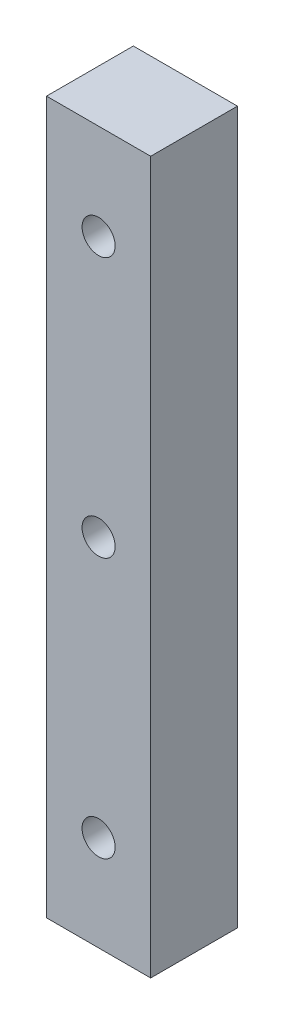
ISO-10303-21;
HEADER;
FILE_DESCRIPTION(('STEP AP214'),'2;1');
FILE_NAME('part.step','',(''),(''),'','','');
FILE_SCHEMA(('AUTOMOTIVE_DESIGN { 1 0 10303 214 1 1 1 1 }'));
ENDSEC;
DATA;
#1=APPLICATION_CONTEXT('core data for automotive mechanical design processes');
#2=APPLICATION_PROTOCOL_DEFINITION('international standard','automotive_design',2000,#1);
#3=PRODUCT_CONTEXT('',#1,'mechanical');
#4=PRODUCT('Part','Part','',(#3));
#5=PRODUCT_RELATED_PRODUCT_CATEGORY('part','',(#4));
#6=PRODUCT_DEFINITION_FORMATION('','',#4);
#7=PRODUCT_DEFINITION_CONTEXT('part definition',#1,'design');
#8=PRODUCT_DEFINITION('design','',#6,#7);
#9=PRODUCT_DEFINITION_SHAPE('','',#8);
#10=(LENGTH_UNIT() NAMED_UNIT(*) SI_UNIT(.MILLI.,.METRE.));
#11=(NAMED_UNIT(*) PLANE_ANGLE_UNIT() SI_UNIT($,.RADIAN.));
#12=(NAMED_UNIT(*) SI_UNIT($,.STERADIAN.) SOLID_ANGLE_UNIT());
#13=UNCERTAINTY_MEASURE_WITH_UNIT(LENGTH_MEASURE(1.E-05),#10,'distance_accuracy_value','');
#14=(GEOMETRIC_REPRESENTATION_CONTEXT(3) GLOBAL_UNCERTAINTY_ASSIGNED_CONTEXT((#13)) GLOBAL_UNIT_ASSIGNED_CONTEXT((#10,
#11,#12)) REPRESENTATION_CONTEXT('',''));
#15=CARTESIAN_POINT('',(0.,0.,0.));
#16=DIRECTION('',(0.,0.,1.));
#17=DIRECTION('',(1.,0.,0.));
#18=AXIS2_PLACEMENT_3D('',#15,#16,#17);
#19=CARTESIAN_POINT('',(0.,204.999999956,0.));
#20=DIRECTION('',(-1.,0.,0.));
#21=DIRECTION('',(0.,0.,1.));
#22=AXIS2_PLACEMENT_3D('',#19,#20,#21);
#23=PLANE('',#22);
#24=DIRECTION('',(0.,0.,-1.));
#25=VECTOR('',#24,1.);
#26=CARTESIAN_POINT('',(0.,0.,0.));
#27=LINE('',#26,#25);
#28=CARTESIAN_POINT('',(0.,0.,25.000000038));
#29=VERTEX_POINT('',#28);
#30=CARTESIAN_POINT('',(0.,0.,0.));
#31=VERTEX_POINT('',#30);
#32=EDGE_CURVE('E110',#29,#31,#27,.T.);
#33=ORIENTED_EDGE('',*,*,#32,.T.);
#34=DIRECTION('',(0.,-1.,0.));
#35=VECTOR('',#34,1.);
#36=CARTESIAN_POINT('',(0.,204.999999956,0.));
#37=LINE('',#36,#35);
#38=CARTESIAN_POINT('',(0.,204.999999956,0.));
#39=VERTEX_POINT('',#38);
#40=EDGE_CURVE('E11',#39,#31,#37,.T.);
#41=ORIENTED_EDGE('',*,*,#40,.F.);
#42=DIRECTION('',(0.,0.,-1.));
#43=VECTOR('',#42,1.);
#44=CARTESIAN_POINT('',(0.,204.999999956,0.));
#45=LINE('',#44,#43);
#46=CARTESIAN_POINT('',(0.,204.999999956,25.000000038));
#47=VERTEX_POINT('',#46);
#48=EDGE_CURVE('E92',#47,#39,#45,.T.);
#49=ORIENTED_EDGE('',*,*,#48,.F.);
#50=DIRECTION('',(0.,-1.,0.));
#51=VECTOR('',#50,1.);
#52=CARTESIAN_POINT('',(0.,204.999999956,25.000000038));
#53=LINE('',#52,#51);
#54=EDGE_CURVE('E103',#47,#29,#53,.T.);
#55=ORIENTED_EDGE('',*,*,#54,.T.);
#56=EDGE_LOOP('',(#33,#41,#49,#55));
#57=FACE_BOUND('',#56,.T.);
#58=ADVANCED_FACE('F42',(#57),#23,.F.);
#59=CARTESIAN_POINT('',(0.,204.999999956,0.));
#60=DIRECTION('',(0.,0.,1.));
#61=DIRECTION('',(1.,0.,0.));
#62=AXIS2_PLACEMENT_3D('',#59,#60,#61);
#63=PLANE('',#62);
#64=CARTESIAN_POINT('',(-14.999999972,177.499999965,0.));
#65=DIRECTION('',(0.,0.,-1.));
#66=DIRECTION('',(-1.,0.,0.));
#67=AXIS2_PLACEMENT_3D('',#64,#65,#66);
#68=CIRCLE('',#67,4.76249999999999);
#69=CARTESIAN_POINT('',(-19.762499972,177.499999965,0.));
#70=VERTEX_POINT('',#69);
#71=EDGE_CURVE('E130',#70,#70,#68,.T.);
#72=ORIENTED_EDGE('',*,*,#71,.F.);
#73=EDGE_LOOP('',(#72));
#74=FACE_BOUND('',#73,.T.);
#75=CARTESIAN_POINT('',(-14.999999972,27.499999991,0.));
#76=DIRECTION('',(0.,0.,-1.));
#77=DIRECTION('',(-1.,0.,0.));
#78=AXIS2_PLACEMENT_3D('',#75,#76,#77);
#79=CIRCLE('',#78,4.7625);
#80=CARTESIAN_POINT('',(-19.762499972,27.499999991,0.));
#81=VERTEX_POINT('',#80);
#82=EDGE_CURVE('E127',#81,#81,#79,.T.);
#83=ORIENTED_EDGE('',*,*,#82,.F.);
#84=EDGE_LOOP('',(#83));
#85=FACE_BOUND('',#84,.T.);
#86=CARTESIAN_POINT('',(-14.999999972,102.499999978,0.));
#87=DIRECTION('',(0.,0.,-1.));
#88=DIRECTION('',(-1.,0.,0.));
#89=AXIS2_PLACEMENT_3D('',#86,#87,#88);
#90=CIRCLE('',#89,4.7625);
#91=CARTESIAN_POINT('',(-19.762499972,102.499999978,0.));
#92=VERTEX_POINT('',#91);
#93=EDGE_CURVE('E123',#92,#92,#90,.T.);
#94=ORIENTED_EDGE('',*,*,#93,.F.);
#95=EDGE_LOOP('',(#94));
#96=FACE_BOUND('',#95,.T.);
#97=DIRECTION('',(-1.,0.,0.));
#98=VECTOR('',#97,1.);
#99=CARTESIAN_POINT('',(0.,0.,0.));
#100=LINE('',#99,#98);
#101=CARTESIAN_POINT('',(-29.999999944,0.,0.));
#102=VERTEX_POINT('',#101);
#103=EDGE_CURVE('E97',#31,#102,#100,.T.);
#104=ORIENTED_EDGE('',*,*,#103,.T.);
#105=DIRECTION('',(0.,-1.,0.));
#106=VECTOR('',#105,1.);
#107=CARTESIAN_POINT('',(-29.999999944,204.999999956,0.));
#108=LINE('',#107,#106);
#109=CARTESIAN_POINT('',(-29.999999944,204.999999956,0.));
#110=VERTEX_POINT('',#109);
#111=EDGE_CURVE('E55',#110,#102,#108,.T.);
#112=ORIENTED_EDGE('',*,*,#111,.F.);
#113=DIRECTION('',(-1.,0.,0.));
#114=VECTOR('',#113,1.);
#115=CARTESIAN_POINT('',(0.,204.999999956,0.));
#116=LINE('',#115,#114);
#117=EDGE_CURVE('E89',#39,#110,#116,.T.);
#118=ORIENTED_EDGE('',*,*,#117,.F.);
#119=ORIENTED_EDGE('',*,*,#40,.T.);
#120=EDGE_LOOP('',(#104,#112,#118,#119));
#121=FACE_BOUND('',#120,.T.);
#122=ADVANCED_FACE('F98',(#74,#85,#96,#121),#63,.F.);
#123=CARTESIAN_POINT('',(-29.999999944,204.999999956,0.));
#124=DIRECTION('',(1.,0.,0.));
#125=DIRECTION('',(0.,0.,-1.));
#126=AXIS2_PLACEMENT_3D('',#123,#124,#125);
#127=PLANE('',#126);
#128=DIRECTION('',(0.,0.,1.));
#129=VECTOR('',#128,1.);
#130=CARTESIAN_POINT('',(-29.999999944,0.,0.));
#131=LINE('',#130,#129);
#132=CARTESIAN_POINT('',(-29.999999944,0.,25.000000038));
#133=VERTEX_POINT('',#132);
#134=EDGE_CURVE('E80',#102,#133,#131,.T.);
#135=ORIENTED_EDGE('',*,*,#134,.T.);
#136=DIRECTION('',(0.,-1.,0.));
#137=VECTOR('',#136,1.);
#138=CARTESIAN_POINT('',(-29.999999944,204.999999956,25.000000038));
#139=LINE('',#138,#137);
#140=CARTESIAN_POINT('',(-29.999999944,204.999999956,25.000000038));
#141=VERTEX_POINT('',#140);
#142=EDGE_CURVE('E99',#141,#133,#139,.T.);
#143=ORIENTED_EDGE('',*,*,#142,.F.);
#144=DIRECTION('',(0.,0.,1.));
#145=VECTOR('',#144,1.);
#146=CARTESIAN_POINT('',(-29.999999944,204.999999956,0.));
#147=LINE('',#146,#145);
#148=EDGE_CURVE('E91',#110,#141,#147,.T.);
#149=ORIENTED_EDGE('',*,*,#148,.F.);
#150=ORIENTED_EDGE('',*,*,#111,.T.);
#151=EDGE_LOOP('',(#135,#143,#149,#150));
#152=FACE_BOUND('',#151,.T.);
#153=ADVANCED_FACE('F101',(#152),#127,.F.);
#154=CARTESIAN_POINT('',(0.,204.999999956,25.000000038));
#155=DIRECTION('',(0.,0.,-1.));
#156=DIRECTION('',(-1.,0.,0.));
#157=AXIS2_PLACEMENT_3D('',#154,#155,#156);
#158=PLANE('',#157);
#159=CARTESIAN_POINT('',(-14.999999972,177.499999965,25.000000038));
#160=DIRECTION('',(0.,0.,-1.));
#161=DIRECTION('',(-1.,0.,0.));
#162=AXIS2_PLACEMENT_3D('',#159,#160,#161);
#163=CIRCLE('',#162,4.76249999999999);
#164=CARTESIAN_POINT('',(-19.762499972,177.499999965,25.000000038));
#165=VERTEX_POINT('',#164);
#166=EDGE_CURVE('E131',#165,#165,#163,.F.);
#167=ORIENTED_EDGE('',*,*,#166,.F.);
#168=EDGE_LOOP('',(#167));
#169=FACE_BOUND('',#168,.T.);
#170=CARTESIAN_POINT('',(-14.999999972,27.499999991,25.000000038));
#171=DIRECTION('',(0.,0.,-1.));
#172=DIRECTION('',(-1.,0.,0.));
#173=AXIS2_PLACEMENT_3D('',#170,#171,#172);
#174=CIRCLE('',#173,4.7625);
#175=CARTESIAN_POINT('',(-19.762499972,27.499999991,25.000000038));
#176=VERTEX_POINT('',#175);
#177=EDGE_CURVE('E128',#176,#176,#174,.F.);
#178=ORIENTED_EDGE('',*,*,#177,.F.);
#179=EDGE_LOOP('',(#178));
#180=FACE_BOUND('',#179,.T.);
#181=CARTESIAN_POINT('',(-14.999999972,102.499999978,25.000000038));
#182=DIRECTION('',(0.,0.,-1.));
#183=DIRECTION('',(-1.,0.,0.));
#184=AXIS2_PLACEMENT_3D('',#181,#182,#183);
#185=CIRCLE('',#184,4.7625);
#186=CARTESIAN_POINT('',(-19.762499972,102.499999978,25.000000038));
#187=VERTEX_POINT('',#186);
#188=EDGE_CURVE('E109',#187,#187,#185,.F.);
#189=ORIENTED_EDGE('',*,*,#188,.F.);
#190=EDGE_LOOP('',(#189));
#191=FACE_BOUND('',#190,.T.);
#192=DIRECTION('',(1.,0.,0.));
#193=VECTOR('',#192,1.);
#194=CARTESIAN_POINT('',(0.,0.,25.000000038));
#195=LINE('',#194,#193);
#196=EDGE_CURVE('E83',#133,#29,#195,.T.);
#197=ORIENTED_EDGE('',*,*,#196,.T.);
#198=ORIENTED_EDGE('',*,*,#54,.F.);
#199=DIRECTION('',(1.,0.,0.));
#200=VECTOR('',#199,1.);
#201=CARTESIAN_POINT('',(0.,204.999999956,25.000000038));
#202=LINE('',#201,#200);
#203=EDGE_CURVE('E58',#141,#47,#202,.T.);
#204=ORIENTED_EDGE('',*,*,#203,.F.);
#205=ORIENTED_EDGE('',*,*,#142,.T.);
#206=EDGE_LOOP('',(#197,#198,#204,#205));
#207=FACE_BOUND('',#206,.T.);
#208=ADVANCED_FACE('F113',(#169,#180,#191,#207),#158,.F.);
#209=CARTESIAN_POINT('',(0.,204.999999956,0.));
#210=DIRECTION('',(0.,-1.,0.));
#211=DIRECTION('',(0.,0.,-1.));
#212=AXIS2_PLACEMENT_3D('',#209,#210,#211);
#213=PLANE('',#212);
#214=ORIENTED_EDGE('',*,*,#48,.T.);
#215=ORIENTED_EDGE('',*,*,#117,.T.);
#216=ORIENTED_EDGE('',*,*,#148,.T.);
#217=ORIENTED_EDGE('',*,*,#203,.T.);
#218=EDGE_LOOP('',(#214,#215,#216,#217));
#219=FACE_BOUND('',#218,.T.);
#220=ADVANCED_FACE('F93',(#219),#213,.F.);
#221=CARTESIAN_POINT('',(0.,0.,0.));
#222=DIRECTION('',(0.,-1.,0.));
#223=DIRECTION('',(0.,0.,-1.));
#224=AXIS2_PLACEMENT_3D('',#221,#222,#223);
#225=PLANE('',#224);
#226=ORIENTED_EDGE('',*,*,#32,.F.);
#227=ORIENTED_EDGE('',*,*,#196,.F.);
#228=ORIENTED_EDGE('',*,*,#134,.F.);
#229=ORIENTED_EDGE('',*,*,#103,.F.);
#230=EDGE_LOOP('',(#226,#227,#228,#229));
#231=FACE_BOUND('',#230,.T.);
#232=ADVANCED_FACE('F117',(#231),#225,.T.);
#233=CARTESIAN_POINT('',(-14.999999972,102.499999978,25.001000038));
#234=DIRECTION('',(0.,0.,-1.));
#235=DIRECTION('',(-1.,0.,0.));
#236=AXIS2_PLACEMENT_3D('',#233,#234,#235);
#237=CYLINDRICAL_SURFACE('',#236,4.7625);
#238=CARTESIAN_POINT('',(-19.762499972,102.499999978,0.));
#239=CARTESIAN_POINT('',(-19.762499972,102.499999978,0.260416667062503));
#240=CARTESIAN_POINT('',(-19.762499972,102.499999978,0.520833334125003));
#241=CARTESIAN_POINT('',(-19.762499972,102.499999978,1.04166666825));
#242=CARTESIAN_POINT('',(-19.762499972,102.499999978,1.3020833353125));
#243=CARTESIAN_POINT('',(-19.762499972,102.499999978,1.8229166694375));
#244=CARTESIAN_POINT('',(-19.762499972,102.499999978,2.0833333365));
#245=CARTESIAN_POINT('',(-19.762499972,102.499999978,2.604166670625));
#246=CARTESIAN_POINT('',(-19.762499972,102.499999978,2.8645833376875));
#247=CARTESIAN_POINT('',(-19.762499972,102.499999978,3.3854166718125));
#248=CARTESIAN_POINT('',(-19.762499972,102.499999978,3.645833338875));
#249=CARTESIAN_POINT('',(-19.762499972,102.499999978,4.166666673));
#250=CARTESIAN_POINT('',(-19.762499972,102.499999978,4.4270833400625));
#251=CARTESIAN_POINT('',(-19.762499972,102.499999978,4.9479166741875));
#252=CARTESIAN_POINT('',(-19.762499972,102.499999978,5.20833334125));
#253=CARTESIAN_POINT('',(-19.762499972,102.499999978,5.729166675375));
#254=CARTESIAN_POINT('',(-19.762499972,102.499999978,5.9895833424375));
#255=CARTESIAN_POINT('',(-19.762499972,102.499999978,6.5104166765625));
#256=CARTESIAN_POINT('',(-19.762499972,102.499999978,6.770833343625));
#257=CARTESIAN_POINT('',(-19.762499972,102.499999978,7.29166667775));
#258=CARTESIAN_POINT('',(-19.762499972,102.499999978,7.55208334481251));
#259=CARTESIAN_POINT('',(-19.762499972,102.499999978,8.0729166789375));
#260=CARTESIAN_POINT('',(-19.762499972,102.499999978,8.333333346));
#261=CARTESIAN_POINT('',(-19.762499972,102.499999978,8.854166680125));
#262=CARTESIAN_POINT('',(-19.762499972,102.499999978,9.1145833471875));
#263=CARTESIAN_POINT('',(-19.762499972,102.499999978,9.6354166813125));
#264=CARTESIAN_POINT('',(-19.762499972,102.499999978,9.895833348375));
#265=CARTESIAN_POINT('',(-19.762499972,102.499999978,10.4166666825));
#266=CARTESIAN_POINT('',(-19.762499972,102.499999978,10.6770833495625));
#267=CARTESIAN_POINT('',(-19.762499972,102.499999978,11.1979166836875));
#268=CARTESIAN_POINT('',(-19.762499972,102.499999978,11.45833335075));
#269=CARTESIAN_POINT('',(-19.762499972,102.499999978,11.979166684875));
#270=CARTESIAN_POINT('',(-19.762499972,102.499999978,12.2395833519375));
#271=CARTESIAN_POINT('',(-19.762499972,102.499999978,12.7604166860625));
#272=CARTESIAN_POINT('',(-19.762499972,102.499999978,13.020833353125));
#273=CARTESIAN_POINT('',(-19.762499972,102.499999978,13.54166668725));
#274=CARTESIAN_POINT('',(-19.762499972,102.499999978,13.8020833543125));
#275=CARTESIAN_POINT('',(-19.762499972,102.499999978,14.3229166884375));
#276=CARTESIAN_POINT('',(-19.762499972,102.499999978,14.5833333555));
#277=CARTESIAN_POINT('',(-19.762499972,102.499999978,15.104166689625));
#278=CARTESIAN_POINT('',(-19.762499972,102.499999978,15.3645833566875));
#279=CARTESIAN_POINT('',(-19.762499972,102.499999978,15.8854166908125));
#280=CARTESIAN_POINT('',(-19.762499972,102.499999978,16.145833357875));
#281=CARTESIAN_POINT('',(-19.762499972,102.499999978,16.666666692));
#282=CARTESIAN_POINT('',(-19.762499972,102.499999978,16.9270833590625));
#283=CARTESIAN_POINT('',(-19.762499972,102.499999978,17.4479166931875));
#284=CARTESIAN_POINT('',(-19.762499972,102.499999978,17.70833336025));
#285=CARTESIAN_POINT('',(-19.762499972,102.499999978,18.229166694375));
#286=CARTESIAN_POINT('',(-19.762499972,102.499999978,18.4895833614375));
#287=CARTESIAN_POINT('',(-19.762499972,102.499999978,19.0104166955625));
#288=CARTESIAN_POINT('',(-19.762499972,102.499999978,19.270833362625));
#289=CARTESIAN_POINT('',(-19.762499972,102.499999978,19.79166669675));
#290=CARTESIAN_POINT('',(-19.762499972,102.499999978,20.0520833638125));
#291=CARTESIAN_POINT('',(-19.762499972,102.499999978,20.5729166979375));
#292=CARTESIAN_POINT('',(-19.762499972,102.499999978,20.833333365));
#293=CARTESIAN_POINT('',(-19.762499972,102.499999978,21.354166699125));
#294=CARTESIAN_POINT('',(-19.762499972,102.499999978,21.6145833661875));
#295=CARTESIAN_POINT('',(-19.762499972,102.499999978,22.1354167003125));
#296=CARTESIAN_POINT('',(-19.762499972,102.499999978,22.395833367375));
#297=CARTESIAN_POINT('',(-19.762499972,102.499999978,22.9166667015));
#298=CARTESIAN_POINT('',(-19.762499972,102.499999978,23.1770833685625));
#299=CARTESIAN_POINT('',(-19.762499972,102.499999978,23.6979167026875));
#300=CARTESIAN_POINT('',(-19.762499972,102.499999978,23.95833336975));
#301=CARTESIAN_POINT('',(-19.762499972,102.499999978,24.479166703875));
#302=CARTESIAN_POINT('',(-19.762499972,102.499999978,24.7395833709375));
#303=CARTESIAN_POINT('',(-19.762499972,102.499999978,25.000000038));
#304=B_SPLINE_CURVE_WITH_KNOTS('',3,(#238,#239,#240,#241,#242,#243,#244,#245,#246,#247,#248,
#249,#250,#251,#252,#253,#254,#255,#256,#257,#258,#259,#260,#261,#262,#263,#264,#265,#266,#267,
#268,#269,#270,#271,#272,#273,#274,#275,#276,#277,#278,#279,#280,#281,#282,#283,#284,#285,#286,
#287,#288,#289,#290,#291,#292,#293,#294,#295,#296,#297,#298,#299,#300,#301,#302,#303),
.UNSPECIFIED.,.F.,.F.,(4,2,2,2,2,2,2,2,2,2,2,2,2,2,2,2,2,2,2,2,2,2,2,2,2,2,2,2,2,2,2,2,4),(0.,
0.781250001187499,1.562500002375,2.3437500035625,3.12500000475,3.9062500059375,4.687500007125,
5.4687500083125,6.2500000095,7.0312500106875,7.812500011875,8.5937500130625,9.37500001425,
10.1562500154375,10.937500016625,11.7187500178125,12.500000019,13.2812500201875,14.062500021375,
14.8437500225625,15.62500002375,16.4062500249375,17.187500026125,17.9687500273125,18.7500000285,
19.5312500296875,20.312500030875,21.0937500320625,21.87500003325,22.6562500344375,
23.437500035625,24.2187500368125,25.000000038),.UNSPECIFIED.);
#305=EDGE_CURVE('BSEAM150',#92,#187,#304,.T.);
#306=ORIENTED_EDGE('',*,*,#93,.T.);
#307=ORIENTED_EDGE('',*,*,#188,.T.);
#308=ORIENTED_EDGE('',*,*,#305,.T.);
#309=ORIENTED_EDGE('',*,*,#305,.F.);
#310=EDGE_LOOP('',(#306,#308,#307,#309));
#311=FACE_BOUND('',#310,.T.);
#312=ADVANCED_FACE('F150',(#311),#237,.F.);
#313=CARTESIAN_POINT('',(-14.999999972,27.499999991,25.001000038));
#314=DIRECTION('',(0.,0.,-1.));
#315=DIRECTION('',(-1.,0.,0.));
#316=AXIS2_PLACEMENT_3D('',#313,#314,#315);
#317=CYLINDRICAL_SURFACE('',#316,4.7625);
#318=CARTESIAN_POINT('',(-19.762499972,27.499999991,0.));
#319=CARTESIAN_POINT('',(-19.762499972,27.499999991,0.260416667062503));
#320=CARTESIAN_POINT('',(-19.762499972,27.499999991,0.520833334125003));
#321=CARTESIAN_POINT('',(-19.762499972,27.499999991,1.04166666825));
#322=CARTESIAN_POINT('',(-19.762499972,27.499999991,1.3020833353125));
#323=CARTESIAN_POINT('',(-19.762499972,27.499999991,1.8229166694375));
#324=CARTESIAN_POINT('',(-19.762499972,27.499999991,2.0833333365));
#325=CARTESIAN_POINT('',(-19.762499972,27.499999991,2.604166670625));
#326=CARTESIAN_POINT('',(-19.762499972,27.499999991,2.8645833376875));
#327=CARTESIAN_POINT('',(-19.762499972,27.499999991,3.3854166718125));
#328=CARTESIAN_POINT('',(-19.762499972,27.499999991,3.645833338875));
#329=CARTESIAN_POINT('',(-19.762499972,27.499999991,4.166666673));
#330=CARTESIAN_POINT('',(-19.762499972,27.499999991,4.4270833400625));
#331=CARTESIAN_POINT('',(-19.762499972,27.499999991,4.9479166741875));
#332=CARTESIAN_POINT('',(-19.762499972,27.499999991,5.20833334125));
#333=CARTESIAN_POINT('',(-19.762499972,27.499999991,5.729166675375));
#334=CARTESIAN_POINT('',(-19.762499972,27.499999991,5.9895833424375));
#335=CARTESIAN_POINT('',(-19.762499972,27.499999991,6.5104166765625));
#336=CARTESIAN_POINT('',(-19.762499972,27.499999991,6.770833343625));
#337=CARTESIAN_POINT('',(-19.762499972,27.499999991,7.29166667775));
#338=CARTESIAN_POINT('',(-19.762499972,27.499999991,7.55208334481251));
#339=CARTESIAN_POINT('',(-19.762499972,27.499999991,8.0729166789375));
#340=CARTESIAN_POINT('',(-19.762499972,27.499999991,8.333333346));
#341=CARTESIAN_POINT('',(-19.762499972,27.499999991,8.854166680125));
#342=CARTESIAN_POINT('',(-19.762499972,27.499999991,9.1145833471875));
#343=CARTESIAN_POINT('',(-19.762499972,27.499999991,9.6354166813125));
#344=CARTESIAN_POINT('',(-19.762499972,27.499999991,9.895833348375));
#345=CARTESIAN_POINT('',(-19.762499972,27.499999991,10.4166666825));
#346=CARTESIAN_POINT('',(-19.762499972,27.499999991,10.6770833495625));
#347=CARTESIAN_POINT('',(-19.762499972,27.499999991,11.1979166836875));
#348=CARTESIAN_POINT('',(-19.762499972,27.499999991,11.45833335075));
#349=CARTESIAN_POINT('',(-19.762499972,27.499999991,11.979166684875));
#350=CARTESIAN_POINT('',(-19.762499972,27.499999991,12.2395833519375));
#351=CARTESIAN_POINT('',(-19.762499972,27.499999991,12.7604166860625));
#352=CARTESIAN_POINT('',(-19.762499972,27.499999991,13.020833353125));
#353=CARTESIAN_POINT('',(-19.762499972,27.499999991,13.54166668725));
#354=CARTESIAN_POINT('',(-19.762499972,27.499999991,13.8020833543125));
#355=CARTESIAN_POINT('',(-19.762499972,27.499999991,14.3229166884375));
#356=CARTESIAN_POINT('',(-19.762499972,27.499999991,14.5833333555));
#357=CARTESIAN_POINT('',(-19.762499972,27.499999991,15.104166689625));
#358=CARTESIAN_POINT('',(-19.762499972,27.499999991,15.3645833566875));
#359=CARTESIAN_POINT('',(-19.762499972,27.499999991,15.8854166908125));
#360=CARTESIAN_POINT('',(-19.762499972,27.499999991,16.145833357875));
#361=CARTESIAN_POINT('',(-19.762499972,27.499999991,16.666666692));
#362=CARTESIAN_POINT('',(-19.762499972,27.499999991,16.9270833590625));
#363=CARTESIAN_POINT('',(-19.762499972,27.499999991,17.4479166931875));
#364=CARTESIAN_POINT('',(-19.762499972,27.499999991,17.70833336025));
#365=CARTESIAN_POINT('',(-19.762499972,27.499999991,18.229166694375));
#366=CARTESIAN_POINT('',(-19.762499972,27.499999991,18.4895833614375));
#367=CARTESIAN_POINT('',(-19.762499972,27.499999991,19.0104166955625));
#368=CARTESIAN_POINT('',(-19.762499972,27.499999991,19.270833362625));
#369=CARTESIAN_POINT('',(-19.762499972,27.499999991,19.79166669675));
#370=CARTESIAN_POINT('',(-19.762499972,27.499999991,20.0520833638125));
#371=CARTESIAN_POINT('',(-19.762499972,27.499999991,20.5729166979375));
#372=CARTESIAN_POINT('',(-19.762499972,27.499999991,20.833333365));
#373=CARTESIAN_POINT('',(-19.762499972,27.499999991,21.354166699125));
#374=CARTESIAN_POINT('',(-19.762499972,27.499999991,21.6145833661875));
#375=CARTESIAN_POINT('',(-19.762499972,27.499999991,22.1354167003125));
#376=CARTESIAN_POINT('',(-19.762499972,27.499999991,22.395833367375));
#377=CARTESIAN_POINT('',(-19.762499972,27.499999991,22.9166667015));
#378=CARTESIAN_POINT('',(-19.762499972,27.499999991,23.1770833685625));
#379=CARTESIAN_POINT('',(-19.762499972,27.499999991,23.6979167026875));
#380=CARTESIAN_POINT('',(-19.762499972,27.499999991,23.95833336975));
#381=CARTESIAN_POINT('',(-19.762499972,27.499999991,24.479166703875));
#382=CARTESIAN_POINT('',(-19.762499972,27.499999991,24.7395833709375));
#383=CARTESIAN_POINT('',(-19.762499972,27.499999991,25.000000038));
#384=B_SPLINE_CURVE_WITH_KNOTS('',3,(#318,#319,#320,#321,#322,#323,#324,#325,#326,#327,#328,
#329,#330,#331,#332,#333,#334,#335,#336,#337,#338,#339,#340,#341,#342,#343,#344,#345,#346,#347,
#348,#349,#350,#351,#352,#353,#354,#355,#356,#357,#358,#359,#360,#361,#362,#363,#364,#365,#366,
#367,#368,#369,#370,#371,#372,#373,#374,#375,#376,#377,#378,#379,#380,#381,#382,#383),
.UNSPECIFIED.,.F.,.F.,(4,2,2,2,2,2,2,2,2,2,2,2,2,2,2,2,2,2,2,2,2,2,2,2,2,2,2,2,2,2,2,2,4),(0.,
0.781250001187499,1.562500002375,2.3437500035625,3.12500000475,3.9062500059375,4.687500007125,
5.4687500083125,6.2500000095,7.0312500106875,7.812500011875,8.5937500130625,9.37500001425,
10.1562500154375,10.937500016625,11.7187500178125,12.500000019,13.2812500201875,14.062500021375,
14.8437500225625,15.62500002375,16.4062500249375,17.187500026125,17.9687500273125,18.7500000285,
19.5312500296875,20.312500030875,21.0937500320625,21.87500003325,22.6562500344375,
23.437500035625,24.2187500368125,25.000000038),.UNSPECIFIED.);
#385=EDGE_CURVE('BSEAM137',#81,#176,#384,.T.);
#386=ORIENTED_EDGE('',*,*,#82,.T.);
#387=ORIENTED_EDGE('',*,*,#177,.T.);
#388=ORIENTED_EDGE('',*,*,#385,.T.);
#389=ORIENTED_EDGE('',*,*,#385,.F.);
#390=EDGE_LOOP('',(#386,#388,#387,#389));
#391=FACE_BOUND('',#390,.T.);
#392=ADVANCED_FACE('F137',(#391),#317,.F.);
#393=CARTESIAN_POINT('',(-14.999999972,177.499999965,25.001000038));
#394=DIRECTION('',(0.,0.,-1.));
#395=DIRECTION('',(-1.,0.,0.));
#396=AXIS2_PLACEMENT_3D('',#393,#394,#395);
#397=CYLINDRICAL_SURFACE('',#396,4.76249999999999);
#398=CARTESIAN_POINT('',(-19.762499972,177.499999965,0.));
#399=CARTESIAN_POINT('',(-19.762499972,177.499999965,0.260416667062503));
#400=CARTESIAN_POINT('',(-19.762499972,177.499999965,0.520833334125003));
#401=CARTESIAN_POINT('',(-19.762499972,177.499999965,1.04166666825));
#402=CARTESIAN_POINT('',(-19.762499972,177.499999965,1.3020833353125));
#403=CARTESIAN_POINT('',(-19.762499972,177.499999965,1.8229166694375));
#404=CARTESIAN_POINT('',(-19.762499972,177.499999965,2.0833333365));
#405=CARTESIAN_POINT('',(-19.762499972,177.499999965,2.604166670625));
#406=CARTESIAN_POINT('',(-19.762499972,177.499999965,2.8645833376875));
#407=CARTESIAN_POINT('',(-19.762499972,177.499999965,3.3854166718125));
#408=CARTESIAN_POINT('',(-19.762499972,177.499999965,3.645833338875));
#409=CARTESIAN_POINT('',(-19.762499972,177.499999965,4.166666673));
#410=CARTESIAN_POINT('',(-19.762499972,177.499999965,4.4270833400625));
#411=CARTESIAN_POINT('',(-19.762499972,177.499999965,4.9479166741875));
#412=CARTESIAN_POINT('',(-19.762499972,177.499999965,5.20833334125));
#413=CARTESIAN_POINT('',(-19.762499972,177.499999965,5.729166675375));
#414=CARTESIAN_POINT('',(-19.762499972,177.499999965,5.9895833424375));
#415=CARTESIAN_POINT('',(-19.762499972,177.499999965,6.5104166765625));
#416=CARTESIAN_POINT('',(-19.762499972,177.499999965,6.770833343625));
#417=CARTESIAN_POINT('',(-19.762499972,177.499999965,7.29166667775));
#418=CARTESIAN_POINT('',(-19.762499972,177.499999965,7.55208334481251));
#419=CARTESIAN_POINT('',(-19.762499972,177.499999965,8.0729166789375));
#420=CARTESIAN_POINT('',(-19.762499972,177.499999965,8.333333346));
#421=CARTESIAN_POINT('',(-19.762499972,177.499999965,8.854166680125));
#422=CARTESIAN_POINT('',(-19.762499972,177.499999965,9.1145833471875));
#423=CARTESIAN_POINT('',(-19.762499972,177.499999965,9.6354166813125));
#424=CARTESIAN_POINT('',(-19.762499972,177.499999965,9.895833348375));
#425=CARTESIAN_POINT('',(-19.762499972,177.499999965,10.4166666825));
#426=CARTESIAN_POINT('',(-19.762499972,177.499999965,10.6770833495625));
#427=CARTESIAN_POINT('',(-19.762499972,177.499999965,11.1979166836875));
#428=CARTESIAN_POINT('',(-19.762499972,177.499999965,11.45833335075));
#429=CARTESIAN_POINT('',(-19.762499972,177.499999965,11.979166684875));
#430=CARTESIAN_POINT('',(-19.762499972,177.499999965,12.2395833519375));
#431=CARTESIAN_POINT('',(-19.762499972,177.499999965,12.7604166860625));
#432=CARTESIAN_POINT('',(-19.762499972,177.499999965,13.020833353125));
#433=CARTESIAN_POINT('',(-19.762499972,177.499999965,13.54166668725));
#434=CARTESIAN_POINT('',(-19.762499972,177.499999965,13.8020833543125));
#435=CARTESIAN_POINT('',(-19.762499972,177.499999965,14.3229166884375));
#436=CARTESIAN_POINT('',(-19.762499972,177.499999965,14.5833333555));
#437=CARTESIAN_POINT('',(-19.762499972,177.499999965,15.104166689625));
#438=CARTESIAN_POINT('',(-19.762499972,177.499999965,15.3645833566875));
#439=CARTESIAN_POINT('',(-19.762499972,177.499999965,15.8854166908125));
#440=CARTESIAN_POINT('',(-19.762499972,177.499999965,16.145833357875));
#441=CARTESIAN_POINT('',(-19.762499972,177.499999965,16.666666692));
#442=CARTESIAN_POINT('',(-19.762499972,177.499999965,16.9270833590625));
#443=CARTESIAN_POINT('',(-19.762499972,177.499999965,17.4479166931875));
#444=CARTESIAN_POINT('',(-19.762499972,177.499999965,17.70833336025));
#445=CARTESIAN_POINT('',(-19.762499972,177.499999965,18.229166694375));
#446=CARTESIAN_POINT('',(-19.762499972,177.499999965,18.4895833614375));
#447=CARTESIAN_POINT('',(-19.762499972,177.499999965,19.0104166955625));
#448=CARTESIAN_POINT('',(-19.762499972,177.499999965,19.270833362625));
#449=CARTESIAN_POINT('',(-19.762499972,177.499999965,19.79166669675));
#450=CARTESIAN_POINT('',(-19.762499972,177.499999965,20.0520833638125));
#451=CARTESIAN_POINT('',(-19.762499972,177.499999965,20.5729166979375));
#452=CARTESIAN_POINT('',(-19.762499972,177.499999965,20.833333365));
#453=CARTESIAN_POINT('',(-19.762499972,177.499999965,21.354166699125));
#454=CARTESIAN_POINT('',(-19.762499972,177.499999965,21.6145833661875));
#455=CARTESIAN_POINT('',(-19.762499972,177.499999965,22.1354167003125));
#456=CARTESIAN_POINT('',(-19.762499972,177.499999965,22.395833367375));
#457=CARTESIAN_POINT('',(-19.762499972,177.499999965,22.9166667015));
#458=CARTESIAN_POINT('',(-19.762499972,177.499999965,23.1770833685625));
#459=CARTESIAN_POINT('',(-19.762499972,177.499999965,23.6979167026875));
#460=CARTESIAN_POINT('',(-19.762499972,177.499999965,23.95833336975));
#461=CARTESIAN_POINT('',(-19.762499972,177.499999965,24.479166703875));
#462=CARTESIAN_POINT('',(-19.762499972,177.499999965,24.7395833709375));
#463=CARTESIAN_POINT('',(-19.762499972,177.499999965,25.000000038));
#464=B_SPLINE_CURVE_WITH_KNOTS('',3,(#398,#399,#400,#401,#402,#403,#404,#405,#406,#407,#408,
#409,#410,#411,#412,#413,#414,#415,#416,#417,#418,#419,#420,#421,#422,#423,#424,#425,#426,#427,
#428,#429,#430,#431,#432,#433,#434,#435,#436,#437,#438,#439,#440,#441,#442,#443,#444,#445,#446,
#447,#448,#449,#450,#451,#452,#453,#454,#455,#456,#457,#458,#459,#460,#461,#462,#463),
.UNSPECIFIED.,.F.,.F.,(4,2,2,2,2,2,2,2,2,2,2,2,2,2,2,2,2,2,2,2,2,2,2,2,2,2,2,2,2,2,2,2,4),(0.,
0.781250001187499,1.562500002375,2.3437500035625,3.12500000475,3.9062500059375,4.687500007125,
5.4687500083125,6.2500000095,7.0312500106875,7.812500011875,8.5937500130625,9.37500001425,
10.1562500154375,10.937500016625,11.7187500178125,12.500000019,13.2812500201875,14.062500021375,
14.8437500225625,15.62500002375,16.4062500249375,17.187500026125,17.9687500273125,18.7500000285,
19.5312500296875,20.312500030875,21.0937500320625,21.87500003325,22.6562500344375,
23.437500035625,24.2187500368125,25.000000038),.UNSPECIFIED.);
#465=EDGE_CURVE('BSEAM152',#70,#165,#464,.T.);
#466=ORIENTED_EDGE('',*,*,#71,.T.);
#467=ORIENTED_EDGE('',*,*,#166,.T.);
#468=ORIENTED_EDGE('',*,*,#465,.T.);
#469=ORIENTED_EDGE('',*,*,#465,.F.);
#470=EDGE_LOOP('',(#466,#468,#467,#469));
#471=FACE_BOUND('',#470,.T.);
#472=ADVANCED_FACE('F152',(#471),#397,.F.);
#473=CLOSED_SHELL('',(#58,#122,#153,#208,#220,#232,#312,#392,#472));
#474=MANIFOLD_SOLID_BREP('B2',#473);
#475=ADVANCED_BREP_SHAPE_REPRESENTATION('',(#18,#474),#14);
#476=SHAPE_DEFINITION_REPRESENTATION(#9,#475);
ENDSEC;
END-ISO-10303-21;
